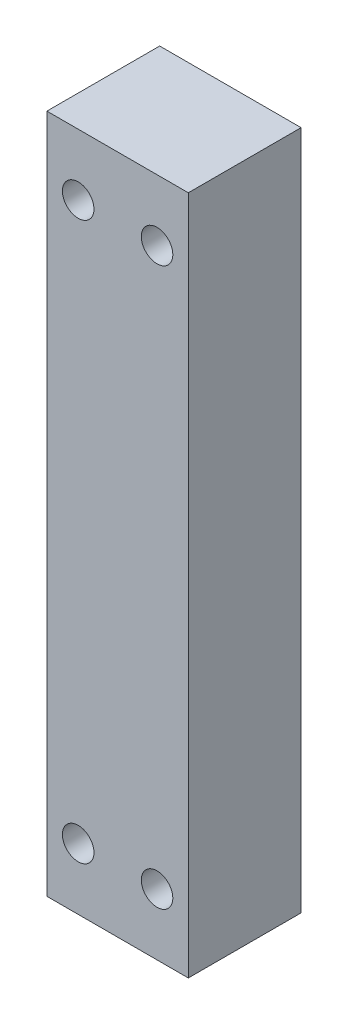
ISO-10303-21;
HEADER;
FILE_DESCRIPTION(('STEP AP214'),'2;1');
FILE_NAME('part.step','',(''),(''),'','','');
FILE_SCHEMA(('AUTOMOTIVE_DESIGN { 1 0 10303 214 1 1 1 1 }'));
ENDSEC;
DATA;
#1=APPLICATION_CONTEXT('core data for automotive mechanical design processes');
#2=APPLICATION_PROTOCOL_DEFINITION('international standard','automotive_design',2000,#1);
#3=PRODUCT_CONTEXT('',#1,'mechanical');
#4=PRODUCT('Part','Part','',(#3));
#5=PRODUCT_RELATED_PRODUCT_CATEGORY('part','',(#4));
#6=PRODUCT_DEFINITION_FORMATION('','',#4);
#7=PRODUCT_DEFINITION_CONTEXT('part definition',#1,'design');
#8=PRODUCT_DEFINITION('design','',#6,#7);
#9=PRODUCT_DEFINITION_SHAPE('','',#8);
#10=(LENGTH_UNIT() NAMED_UNIT(*) SI_UNIT(.MILLI.,.METRE.));
#11=(NAMED_UNIT(*) PLANE_ANGLE_UNIT() SI_UNIT($,.RADIAN.));
#12=(NAMED_UNIT(*) SI_UNIT($,.STERADIAN.) SOLID_ANGLE_UNIT());
#13=UNCERTAINTY_MEASURE_WITH_UNIT(LENGTH_MEASURE(1.E-05),#10,'distance_accuracy_value','');
#14=(GEOMETRIC_REPRESENTATION_CONTEXT(3) GLOBAL_UNCERTAINTY_ASSIGNED_CONTEXT((#13)) GLOBAL_UNIT_ASSIGNED_CONTEXT((#10,
#11,#12)) REPRESENTATION_CONTEXT('',''));
#15=CARTESIAN_POINT('',(0.,0.,0.));
#16=DIRECTION('',(0.,0.,1.));
#17=DIRECTION('',(1.,0.,0.));
#18=AXIS2_PLACEMENT_3D('',#15,#16,#17);
#19=CARTESIAN_POINT('',(2.88646718201379,58.6865740740741,-21.45));
#20=DIRECTION('',(-1.,0.,0.));
#21=DIRECTION('',(0.,-1.,0.));
#22=AXIS2_PLACEMENT_3D('',#19,#20,#21);
#23=PLANE('',#22);
#24=DIRECTION('',(0.,-1.,0.));
#25=VECTOR('',#24,1.);
#26=CARTESIAN_POINT('',(2.88646718201379,58.6865740740741,0.));
#27=LINE('',#26,#25);
#28=CARTESIAN_POINT('',(2.88646718201379,58.6865740740741,0.));
#29=VERTEX_POINT('',#28);
#30=CARTESIAN_POINT('',(2.88646718201381,-70.6634259259259,0.));
#31=VERTEX_POINT('',#30);
#32=EDGE_CURVE('E110',#29,#31,#27,.T.);
#33=ORIENTED_EDGE('',*,*,#32,.F.);
#34=DIRECTION('',(0.,0.,1.));
#35=VECTOR('',#34,1.);
#36=CARTESIAN_POINT('',(2.88646718201379,58.6865740740741,-21.45));
#37=LINE('',#36,#35);
#38=CARTESIAN_POINT('',(2.88646718201379,58.6865740740741,-21.45));
#39=VERTEX_POINT('',#38);
#40=EDGE_CURVE('E11',#39,#29,#37,.T.);
#41=ORIENTED_EDGE('',*,*,#40,.F.);
#42=DIRECTION('',(0.,-1.,0.));
#43=VECTOR('',#42,1.);
#44=CARTESIAN_POINT('',(2.88646718201379,58.6865740740741,-21.45));
#45=LINE('',#44,#43);
#46=CARTESIAN_POINT('',(2.88646718201381,-70.6634259259259,-21.45));
#47=VERTEX_POINT('',#46);
#48=EDGE_CURVE('E99',#39,#47,#45,.T.);
#49=ORIENTED_EDGE('',*,*,#48,.T.);
#50=DIRECTION('',(0.,0.,1.));
#51=VECTOR('',#50,1.);
#52=CARTESIAN_POINT('',(2.88646718201381,-70.6634259259259,-21.45));
#53=LINE('',#52,#51);
#54=EDGE_CURVE('E44',#47,#31,#53,.T.);
#55=ORIENTED_EDGE('',*,*,#54,.T.);
#56=EDGE_LOOP('',(#33,#41,#49,#55));
#57=FACE_BOUND('',#56,.T.);
#58=ADVANCED_FACE('F45',(#57),#23,.T.);
#59=CARTESIAN_POINT('',(2.88646718201379,58.6865740740741,-21.45));
#60=DIRECTION('',(0.,1.,0.));
#61=DIRECTION('',(0.,0.,1.));
#62=AXIS2_PLACEMENT_3D('',#59,#60,#61);
#63=PLANE('',#62);
#64=DIRECTION('',(-1.,0.,0.));
#65=VECTOR('',#64,1.);
#66=CARTESIAN_POINT('',(2.88646718201379,58.6865740740741,0.));
#67=LINE('',#66,#65);
#68=CARTESIAN_POINT('',(29.7864671820138,58.6865740740741,0.));
#69=VERTEX_POINT('',#68);
#70=EDGE_CURVE('E105',#69,#29,#67,.T.);
#71=ORIENTED_EDGE('',*,*,#70,.F.);
#72=DIRECTION('',(0.,0.,1.));
#73=VECTOR('',#72,1.);
#74=CARTESIAN_POINT('',(29.7864671820138,58.6865740740741,-21.45));
#75=LINE('',#74,#73);
#76=CARTESIAN_POINT('',(29.7864671820138,58.6865740740741,-21.45));
#77=VERTEX_POINT('',#76);
#78=EDGE_CURVE('E51',#77,#69,#75,.T.);
#79=ORIENTED_EDGE('',*,*,#78,.F.);
#80=DIRECTION('',(-1.,0.,0.));
#81=VECTOR('',#80,1.);
#82=CARTESIAN_POINT('',(2.88646718201379,58.6865740740741,-21.45));
#83=LINE('',#82,#81);
#84=EDGE_CURVE('E100',#77,#39,#83,.T.);
#85=ORIENTED_EDGE('',*,*,#84,.T.);
#86=ORIENTED_EDGE('',*,*,#40,.T.);
#87=EDGE_LOOP('',(#71,#79,#85,#86));
#88=FACE_BOUND('',#87,.T.);
#89=ADVANCED_FACE('F119',(#88),#63,.T.);
#90=CARTESIAN_POINT('',(29.7864671820138,58.6865740740741,-21.45));
#91=DIRECTION('',(1.,0.,0.));
#92=DIRECTION('',(0.,0.,-1.));
#93=AXIS2_PLACEMENT_3D('',#90,#91,#92);
#94=PLANE('',#93);
#95=DIRECTION('',(0.,1.,0.));
#96=VECTOR('',#95,1.);
#97=CARTESIAN_POINT('',(29.7864671820138,58.6865740740741,0.));
#98=LINE('',#97,#96);
#99=CARTESIAN_POINT('',(29.7864671820138,-70.6634259259259,0.));
#100=VERTEX_POINT('',#99);
#101=EDGE_CURVE('E95',#100,#69,#98,.T.);
#102=ORIENTED_EDGE('',*,*,#101,.F.);
#103=DIRECTION('',(0.,0.,1.));
#104=VECTOR('',#103,1.);
#105=CARTESIAN_POINT('',(29.7864671820138,-70.6634259259259,-21.45));
#106=LINE('',#105,#104);
#107=CARTESIAN_POINT('',(29.7864671820138,-70.6634259259259,-21.45));
#108=VERTEX_POINT('',#107);
#109=EDGE_CURVE('E87',#108,#100,#106,.T.);
#110=ORIENTED_EDGE('',*,*,#109,.F.);
#111=DIRECTION('',(0.,1.,0.));
#112=VECTOR('',#111,1.);
#113=CARTESIAN_POINT('',(29.7864671820138,58.6865740740741,-21.45));
#114=LINE('',#113,#112);
#115=EDGE_CURVE('E89',#108,#77,#114,.T.);
#116=ORIENTED_EDGE('',*,*,#115,.T.);
#117=ORIENTED_EDGE('',*,*,#78,.T.);
#118=EDGE_LOOP('',(#102,#110,#116,#117));
#119=FACE_BOUND('',#118,.T.);
#120=ADVANCED_FACE('F90',(#119),#94,.T.);
#121=CARTESIAN_POINT('',(2.88646718201381,-70.6634259259259,-21.45));
#122=DIRECTION('',(0.,-1.,0.));
#123=DIRECTION('',(0.,0.,-1.));
#124=AXIS2_PLACEMENT_3D('',#121,#122,#123);
#125=PLANE('',#124);
#126=DIRECTION('',(1.,0.,0.));
#127=VECTOR('',#126,1.);
#128=CARTESIAN_POINT('',(2.88646718201381,-70.6634259259259,0.));
#129=LINE('',#128,#127);
#130=EDGE_CURVE('E109',#31,#100,#129,.T.);
#131=ORIENTED_EDGE('',*,*,#130,.F.);
#132=ORIENTED_EDGE('',*,*,#54,.F.);
#133=DIRECTION('',(1.,0.,0.));
#134=VECTOR('',#133,1.);
#135=CARTESIAN_POINT('',(2.88646718201381,-70.6634259259259,-21.45));
#136=LINE('',#135,#134);
#137=EDGE_CURVE('E96',#47,#108,#136,.T.);
#138=ORIENTED_EDGE('',*,*,#137,.T.);
#139=ORIENTED_EDGE('',*,*,#109,.T.);
#140=EDGE_LOOP('',(#131,#132,#138,#139));
#141=FACE_BOUND('',#140,.T.);
#142=ADVANCED_FACE('F97',(#141),#125,.T.);
#143=CARTESIAN_POINT('',(0.,0.,-21.45));
#144=DIRECTION('',(0.,0.,1.));
#145=DIRECTION('',(1.,0.,0.));
#146=AXIS2_PLACEMENT_3D('',#143,#144,#145);
#147=PLANE('',#146);
#148=CARTESIAN_POINT('',(8.83646718201381,47.0115740740741,-21.45));
#149=DIRECTION('',(0.,0.,1.));
#150=DIRECTION('',(1.,0.,0.));
#151=AXIS2_PLACEMENT_3D('',#148,#149,#150);
#152=CIRCLE('',#151,3.);
#153=CARTESIAN_POINT('',(11.8364671820138,47.0115740740741,-21.45));
#154=VERTEX_POINT('',#153);
#155=EDGE_CURVE('E173',#154,#154,#152,.T.);
#156=ORIENTED_EDGE('',*,*,#155,.T.);
#157=EDGE_LOOP('',(#156));
#158=FACE_BOUND('',#157,.T.);
#159=CARTESIAN_POINT('',(23.8364671820138,-58.9884259259259,-21.45));
#160=DIRECTION('',(0.,0.,1.));
#161=DIRECTION('',(1.,0.,0.));
#162=AXIS2_PLACEMENT_3D('',#159,#160,#161);
#163=CIRCLE('',#162,3.);
#164=CARTESIAN_POINT('',(26.8364671820138,-58.9884259259259,-21.45));
#165=VERTEX_POINT('',#164);
#166=EDGE_CURVE('E169',#165,#165,#163,.T.);
#167=ORIENTED_EDGE('',*,*,#166,.T.);
#168=EDGE_LOOP('',(#167));
#169=FACE_BOUND('',#168,.T.);
#170=CARTESIAN_POINT('',(8.83646718201381,-58.9884259259259,-21.45));
#171=DIRECTION('',(0.,0.,1.));
#172=DIRECTION('',(1.,0.,0.));
#173=AXIS2_PLACEMENT_3D('',#170,#171,#172);
#174=CIRCLE('',#173,3.);
#175=CARTESIAN_POINT('',(11.8364671820138,-58.9884259259259,-21.45));
#176=VERTEX_POINT('',#175);
#177=EDGE_CURVE('E162',#176,#176,#174,.T.);
#178=ORIENTED_EDGE('',*,*,#177,.T.);
#179=EDGE_LOOP('',(#178));
#180=FACE_BOUND('',#179,.T.);
#181=CARTESIAN_POINT('',(23.8364671820138,47.0115740740741,-21.45));
#182=DIRECTION('',(0.,0.,1.));
#183=DIRECTION('',(1.,0.,0.));
#184=AXIS2_PLACEMENT_3D('',#181,#182,#183);
#185=CIRCLE('',#184,3.);
#186=CARTESIAN_POINT('',(26.8364671820138,47.0115740740741,-21.45));
#187=VERTEX_POINT('',#186);
#188=EDGE_CURVE('E178',#187,#187,#185,.T.);
#189=ORIENTED_EDGE('',*,*,#188,.T.);
#190=EDGE_LOOP('',(#189));
#191=FACE_BOUND('',#190,.T.);
#192=ORIENTED_EDGE('',*,*,#48,.F.);
#193=ORIENTED_EDGE('',*,*,#84,.F.);
#194=ORIENTED_EDGE('',*,*,#115,.F.);
#195=ORIENTED_EDGE('',*,*,#137,.F.);
#196=EDGE_LOOP('',(#192,#193,#194,#195));
#197=FACE_BOUND('',#196,.T.);
#198=ADVANCED_FACE('F92',(#158,#169,#180,#191,#197),#147,.F.);
#199=CARTESIAN_POINT('',(0.,0.,0.));
#200=DIRECTION('',(0.,0.,1.));
#201=DIRECTION('',(1.,0.,0.));
#202=AXIS2_PLACEMENT_3D('',#199,#200,#201);
#203=PLANE('',#202);
#204=CARTESIAN_POINT('',(8.83646718201381,47.0115740740741,0.));
#205=DIRECTION('',(0.,0.,1.));
#206=DIRECTION('',(1.,0.,0.));
#207=AXIS2_PLACEMENT_3D('',#204,#205,#206);
#208=CIRCLE('',#207,3.);
#209=CARTESIAN_POINT('',(11.8364671820138,47.0115740740741,0.));
#210=VERTEX_POINT('',#209);
#211=EDGE_CURVE('E175',#210,#210,#208,.T.);
#212=ORIENTED_EDGE('',*,*,#211,.F.);
#213=EDGE_LOOP('',(#212));
#214=FACE_BOUND('',#213,.T.);
#215=CARTESIAN_POINT('',(23.8364671820138,-58.9884259259259,0.));
#216=DIRECTION('',(0.,0.,1.));
#217=DIRECTION('',(1.,0.,0.));
#218=AXIS2_PLACEMENT_3D('',#215,#216,#217);
#219=CIRCLE('',#218,3.);
#220=CARTESIAN_POINT('',(26.8364671820138,-58.9884259259259,0.));
#221=VERTEX_POINT('',#220);
#222=EDGE_CURVE('E164',#221,#221,#219,.T.);
#223=ORIENTED_EDGE('',*,*,#222,.F.);
#224=EDGE_LOOP('',(#223));
#225=FACE_BOUND('',#224,.T.);
#226=CARTESIAN_POINT('',(8.83646718201381,-58.9884259259259,0.));
#227=DIRECTION('',(0.,0.,1.));
#228=DIRECTION('',(1.,0.,0.));
#229=AXIS2_PLACEMENT_3D('',#226,#227,#228);
#230=CIRCLE('',#229,3.);
#231=CARTESIAN_POINT('',(11.8364671820138,-58.9884259259259,0.));
#232=VERTEX_POINT('',#231);
#233=EDGE_CURVE('E159',#232,#232,#230,.T.);
#234=ORIENTED_EDGE('',*,*,#233,.F.);
#235=EDGE_LOOP('',(#234));
#236=FACE_BOUND('',#235,.T.);
#237=CARTESIAN_POINT('',(23.8364671820138,47.0115740740741,0.));
#238=DIRECTION('',(0.,0.,1.));
#239=DIRECTION('',(1.,0.,0.));
#240=AXIS2_PLACEMENT_3D('',#237,#238,#239);
#241=CIRCLE('',#240,3.);
#242=CARTESIAN_POINT('',(26.8364671820138,47.0115740740741,0.));
#243=VERTEX_POINT('',#242);
#244=EDGE_CURVE('E112',#243,#243,#241,.T.);
#245=ORIENTED_EDGE('',*,*,#244,.F.);
#246=EDGE_LOOP('',(#245));
#247=FACE_BOUND('',#246,.T.);
#248=ORIENTED_EDGE('',*,*,#32,.T.);
#249=ORIENTED_EDGE('',*,*,#130,.T.);
#250=ORIENTED_EDGE('',*,*,#101,.T.);
#251=ORIENTED_EDGE('',*,*,#70,.T.);
#252=EDGE_LOOP('',(#248,#249,#250,#251));
#253=FACE_BOUND('',#252,.T.);
#254=ADVANCED_FACE('F120',(#214,#225,#236,#247,#253),#203,.T.);
#255=CARTESIAN_POINT('',(23.8364671820138,47.0115740740741,0.001000000000001));
#256=DIRECTION('',(0.,0.,-1.));
#257=DIRECTION('',(-1.,0.,0.));
#258=AXIS2_PLACEMENT_3D('',#255,#256,#257);
#259=CYLINDRICAL_SURFACE('',#258,3.);
#260=ORIENTED_EDGE('',*,*,#244,.T.);
#261=EDGE_LOOP('',(#260));
#262=FACE_BOUND('',#261,.T.);
#263=ORIENTED_EDGE('',*,*,#188,.F.);
#264=EDGE_LOOP('',(#263));
#265=FACE_BOUND('',#264,.T.);
#266=ADVANCED_FACE('F137',(#262,#265),#259,.F.);
#267=CARTESIAN_POINT('',(8.83646718201381,-58.9884259259259,0.001000000000001));
#268=DIRECTION('',(0.,0.,-1.));
#269=DIRECTION('',(-1.,0.,0.));
#270=AXIS2_PLACEMENT_3D('',#267,#268,#269);
#271=CYLINDRICAL_SURFACE('',#270,3.);
#272=ORIENTED_EDGE('',*,*,#233,.T.);
#273=EDGE_LOOP('',(#272));
#274=FACE_BOUND('',#273,.T.);
#275=ORIENTED_EDGE('',*,*,#177,.F.);
#276=EDGE_LOOP('',(#275));
#277=FACE_BOUND('',#276,.T.);
#278=ADVANCED_FACE('F141',(#274,#277),#271,.F.);
#279=CARTESIAN_POINT('',(23.8364671820138,-58.9884259259259,0.001000000000001));
#280=DIRECTION('',(0.,0.,-1.));
#281=DIRECTION('',(-1.,0.,0.));
#282=AXIS2_PLACEMENT_3D('',#279,#280,#281);
#283=CYLINDRICAL_SURFACE('',#282,3.);
#284=ORIENTED_EDGE('',*,*,#222,.T.);
#285=EDGE_LOOP('',(#284));
#286=FACE_BOUND('',#285,.T.);
#287=ORIENTED_EDGE('',*,*,#166,.F.);
#288=EDGE_LOOP('',(#287));
#289=FACE_BOUND('',#288,.T.);
#290=ADVANCED_FACE('F144',(#286,#289),#283,.F.);
#291=CARTESIAN_POINT('',(8.83646718201381,47.0115740740741,0.001000000000001));
#292=DIRECTION('',(0.,0.,-1.));
#293=DIRECTION('',(-1.,0.,0.));
#294=AXIS2_PLACEMENT_3D('',#291,#292,#293);
#295=CYLINDRICAL_SURFACE('',#294,3.);
#296=ORIENTED_EDGE('',*,*,#211,.T.);
#297=EDGE_LOOP('',(#296));
#298=FACE_BOUND('',#297,.T.);
#299=ORIENTED_EDGE('',*,*,#155,.F.);
#300=EDGE_LOOP('',(#299));
#301=FACE_BOUND('',#300,.T.);
#302=ADVANCED_FACE('F146',(#298,#301),#295,.F.);
#303=CLOSED_SHELL('',(#58,#89,#120,#142,#198,#254,#266,#278,#290,#302));
#304=MANIFOLD_SOLID_BREP('B2',#303);
#305=ADVANCED_BREP_SHAPE_REPRESENTATION('',(#18,#304),#14);
#306=SHAPE_DEFINITION_REPRESENTATION(#9,#305);
ENDSEC;
END-ISO-10303-21;
